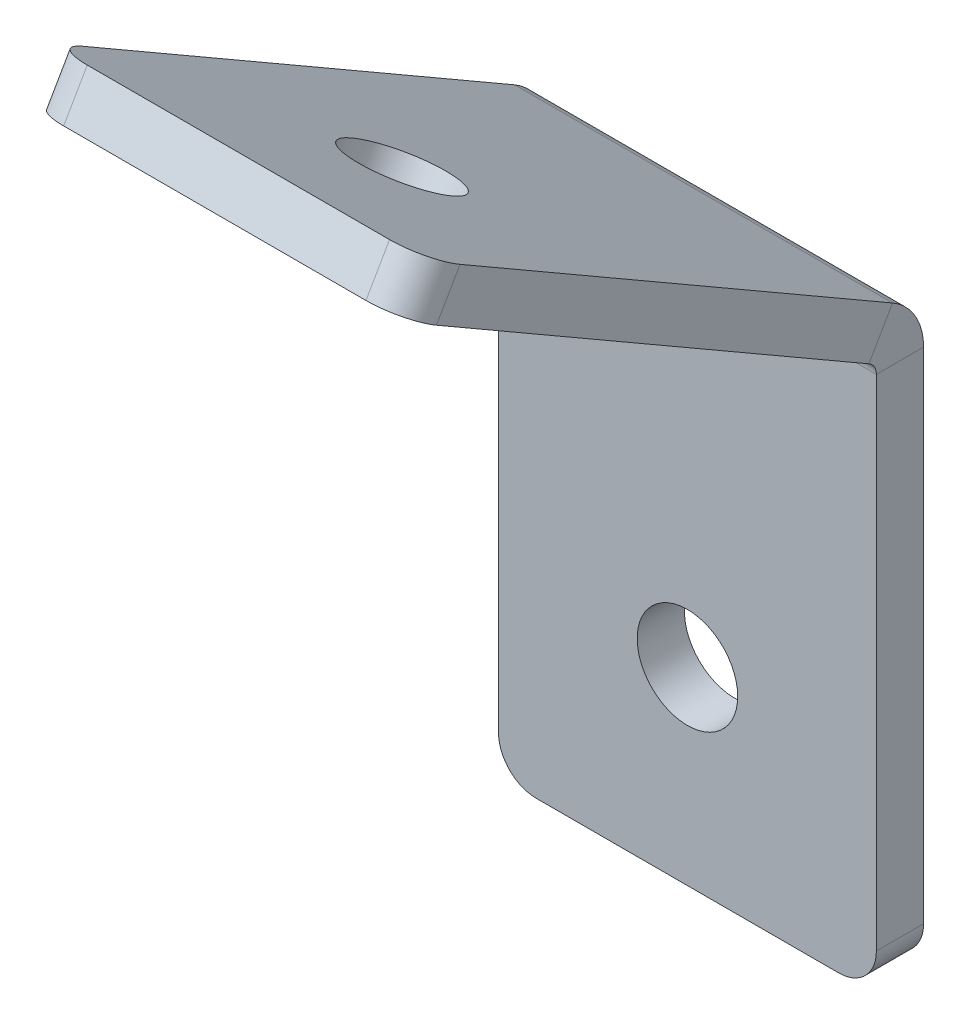
ISO-10303-21;
HEADER;
FILE_DESCRIPTION(('STEP AP214'),'2;1');
FILE_NAME('part.step','',(''),(''),'','','');
FILE_SCHEMA(('AUTOMOTIVE_DESIGN { 1 0 10303 214 1 1 1 1 }'));
ENDSEC;
DATA;
#1=APPLICATION_CONTEXT('core data for automotive mechanical design processes');
#2=APPLICATION_PROTOCOL_DEFINITION('international standard','automotive_design',2000,#1);
#3=PRODUCT_CONTEXT('',#1,'mechanical');
#4=PRODUCT('Part','Part','',(#3));
#5=PRODUCT_RELATED_PRODUCT_CATEGORY('part','',(#4));
#6=PRODUCT_DEFINITION_FORMATION('','',#4);
#7=PRODUCT_DEFINITION_CONTEXT('part definition',#1,'design');
#8=PRODUCT_DEFINITION('design','',#6,#7);
#9=PRODUCT_DEFINITION_SHAPE('','',#8);
#10=(LENGTH_UNIT() NAMED_UNIT(*) SI_UNIT(.MILLI.,.METRE.));
#11=(NAMED_UNIT(*) PLANE_ANGLE_UNIT() SI_UNIT($,.RADIAN.));
#12=(NAMED_UNIT(*) SI_UNIT($,.STERADIAN.) SOLID_ANGLE_UNIT());
#13=UNCERTAINTY_MEASURE_WITH_UNIT(LENGTH_MEASURE(1.E-05),#10,'distance_accuracy_value','');
#14=(GEOMETRIC_REPRESENTATION_CONTEXT(3) GLOBAL_UNCERTAINTY_ASSIGNED_CONTEXT((#13)) GLOBAL_UNIT_ASSIGNED_CONTEXT((#10,
#11,#12)) REPRESENTATION_CONTEXT('',''));
#15=CARTESIAN_POINT('',(0.,0.,0.));
#16=DIRECTION('',(0.,0.,1.));
#17=DIRECTION('',(1.,0.,0.));
#18=AXIS2_PLACEMENT_3D('',#15,#16,#17);
#19=CARTESIAN_POINT('',(-10.16,28.3613076559935,29.5726357634325));
#20=DIRECTION('',(0.,0.86602540378444,-0.499999999999998));
#21=DIRECTION('',(-1.,0.,0.));
#22=AXIS2_PLACEMENT_3D('',#19,#20,#21);
#23=PLANE('',#22);
#24=CARTESIAN_POINT('',(0.,23.2813076559935,20.7738176609826));
#25=DIRECTION('',(0.,-0.86602540378444,0.499999999999998));
#26=DIRECTION('',(1.,0.,0.));
#27=AXIS2_PLACEMENT_3D('',#24,#25,#26);
#28=CIRCLE('',#27,3.3782);
#29=CARTESIAN_POINT('',(3.3782,23.2813076559935,20.7738176609826));
#30=VERTEX_POINT('',#29);
#31=EDGE_CURVE('E221',#30,#30,#28,.T.);
#32=ORIENTED_EDGE('',*,*,#31,.F.);
#33=EDGE_LOOP('',(#32));
#34=FACE_BOUND('',#33,.T.);
#35=DIRECTION('',(0.,-0.499999999999998,-0.86602540378444));
#36=VECTOR('',#35,1.);
#37=CARTESIAN_POINT('',(-12.7,-6.56369234400637,-30.9192386909106));
#38=LINE('',#37,#36);
#39=CARTESIAN_POINT('',(-12.7,28.3613076559935,29.5726357634325));
#40=VERTEX_POINT('',#39);
#41=CARTESIAN_POINT('',(-12.7,11.5762135719239,0.499999999999987));
#42=VERTEX_POINT('',#41);
#43=EDGE_CURVE('E68',#40,#42,#38,.T.);
#44=ORIENTED_EDGE('',*,*,#43,.T.);
#45=DIRECTION('',(1.,0.,0.));
#46=VECTOR('',#45,1.);
#47=CARTESIAN_POINT('',(-10.16,11.5762135719239,0.499999999999983));
#48=LINE('',#47,#46);
#49=CARTESIAN_POINT('',(12.7,11.5762135719239,0.499999999999983));
#50=VERTEX_POINT('',#49);
#51=EDGE_CURVE('E60',#42,#50,#48,.T.);
#52=ORIENTED_EDGE('',*,*,#51,.T.);
#53=DIRECTION('',(0.,0.499999999999998,0.86602540378444));
#54=VECTOR('',#53,1.);
#55=CARTESIAN_POINT('',(12.7,-6.56369234400637,-30.9192386909106));
#56=LINE('',#55,#54);
#57=CARTESIAN_POINT('',(12.7,28.3613076559935,29.5726357634325));
#58=VERTEX_POINT('',#57);
#59=EDGE_CURVE('E76',#50,#58,#56,.T.);
#60=ORIENTED_EDGE('',*,*,#59,.T.);
#61=CARTESIAN_POINT('',(10.16,28.3613076559935,29.5726357634325));
#62=DIRECTION('',(0.,-0.86602540378444,0.499999999999998));
#63=DIRECTION('',(1.,0.,0.));
#64=AXIS2_PLACEMENT_3D('',#61,#62,#63);
#65=CIRCLE('',#64,2.54);
#66=CARTESIAN_POINT('',(10.16,29.6313076559935,31.772340289045));
#67=VERTEX_POINT('',#66);
#68=EDGE_CURVE('E243',#58,#67,#65,.T.);
#69=ORIENTED_EDGE('',*,*,#68,.T.);
#70=DIRECTION('',(-1.,0.,0.));
#71=VECTOR('',#70,1.);
#72=CARTESIAN_POINT('',(-10.16,29.6313076559935,31.772340289045));
#73=LINE('',#72,#71);
#74=CARTESIAN_POINT('',(-10.16,29.6313076559935,31.772340289045));
#75=VERTEX_POINT('',#74);
#76=EDGE_CURVE('E231',#67,#75,#73,.T.);
#77=ORIENTED_EDGE('',*,*,#76,.T.);
#78=CARTESIAN_POINT('',(-10.16,28.3613076559935,29.5726357634325));
#79=DIRECTION('',(0.,-0.86602540378444,0.499999999999998));
#80=DIRECTION('',(-1.,0.,0.));
#81=AXIS2_PLACEMENT_3D('',#78,#79,#80);
#82=CIRCLE('',#81,2.54);
#83=EDGE_CURVE('E220',#75,#40,#82,.T.);
#84=ORIENTED_EDGE('',*,*,#83,.T.);
#85=EDGE_LOOP('',(#44,#52,#60,#69,#77,#84));
#86=FACE_BOUND('',#85,.T.);
#87=ADVANCED_FACE('F50',(#34,#86),#23,.F.);
#88=CARTESIAN_POINT('',(-10.16,31.1109383130091,27.9851357634325));
#89=DIRECTION('',(0.,-0.86602540378444,0.499999999999998));
#90=DIRECTION('',(1.,0.,0.));
#91=AXIS2_PLACEMENT_3D('',#88,#89,#90);
#92=CYLINDRICAL_SURFACE('',#91,2.54);
#93=ORIENTED_EDGE('',*,*,#83,.F.);
#94=DIRECTION('',(0.,-0.86602540378444,0.499999999999998));
#95=VECTOR('',#94,1.);
#96=CARTESIAN_POINT('',(-10.16,32.3809383130091,30.184840289045));
#97=LINE('',#96,#95);
#98=CARTESIAN_POINT('',(-10.16,32.3809383130091,30.184840289045));
#99=VERTEX_POINT('',#98);
#100=EDGE_CURVE('E250',#99,#75,#97,.T.);
#101=ORIENTED_EDGE('',*,*,#100,.F.);
#102=CARTESIAN_POINT('',(-10.16,31.1109383130091,27.9851357634325));
#103=DIRECTION('',(0.,-0.86602540378444,0.499999999999998));
#104=DIRECTION('',(-1.,0.,0.));
#105=AXIS2_PLACEMENT_3D('',#102,#103,#104);
#106=CIRCLE('',#105,2.54);
#107=CARTESIAN_POINT('',(-12.7,31.1109383130091,27.9851357634325));
#108=VERTEX_POINT('',#107);
#109=EDGE_CURVE('E226',#99,#108,#106,.T.);
#110=ORIENTED_EDGE('',*,*,#109,.T.);
#111=DIRECTION('',(0.,-0.86602540378444,0.499999999999998));
#112=VECTOR('',#111,1.);
#113=CARTESIAN_POINT('',(-12.7,31.1109383130091,27.9851357634325));
#114=LINE('',#113,#112);
#115=EDGE_CURVE('E240',#108,#40,#114,.T.);
#116=ORIENTED_EDGE('',*,*,#115,.T.);
#117=EDGE_LOOP('',(#93,#101,#110,#116));
#118=FACE_BOUND('',#117,.T.);
#119=ADVANCED_FACE('F335',(#118),#92,.T.);
#120=CARTESIAN_POINT('',(-10.16,32.3809383130091,30.184840289045));
#121=DIRECTION('',(0.,0.499999999999998,0.86602540378444));
#122=DIRECTION('',(0.,-0.86602540378444,0.499999999999998));
#123=AXIS2_PLACEMENT_3D('',#120,#121,#122);
#124=PLANE('',#123);
#125=ORIENTED_EDGE('',*,*,#76,.F.);
#126=DIRECTION('',(0.,-0.86602540378444,0.499999999999998));
#127=VECTOR('',#126,1.);
#128=CARTESIAN_POINT('',(10.16,32.3809383130091,30.184840289045));
#129=LINE('',#128,#127);
#130=CARTESIAN_POINT('',(10.16,32.3809383130091,30.184840289045));
#131=VERTEX_POINT('',#130);
#132=EDGE_CURVE('E253',#131,#67,#129,.T.);
#133=ORIENTED_EDGE('',*,*,#132,.F.);
#134=DIRECTION('',(-1.,0.,0.));
#135=VECTOR('',#134,1.);
#136=CARTESIAN_POINT('',(-10.16,32.3809383130091,30.184840289045));
#137=LINE('',#136,#135);
#138=EDGE_CURVE('E236',#131,#99,#137,.T.);
#139=ORIENTED_EDGE('',*,*,#138,.T.);
#140=ORIENTED_EDGE('',*,*,#100,.T.);
#141=EDGE_LOOP('',(#125,#133,#139,#140));
#142=FACE_BOUND('',#141,.T.);
#143=ADVANCED_FACE('F332',(#142),#124,.T.);
#144=CARTESIAN_POINT('',(10.16,31.1109383130091,27.9851357634325));
#145=DIRECTION('',(0.,-0.86602540378444,0.499999999999998));
#146=DIRECTION('',(1.,0.,0.));
#147=AXIS2_PLACEMENT_3D('',#144,#145,#146);
#148=CYLINDRICAL_SURFACE('',#147,2.54);
#149=ORIENTED_EDGE('',*,*,#68,.F.);
#150=DIRECTION('',(0.,-0.86602540378444,0.499999999999998));
#151=VECTOR('',#150,1.);
#152=CARTESIAN_POINT('',(12.7,31.1109383130091,27.9851357634325));
#153=LINE('',#152,#151);
#154=CARTESIAN_POINT('',(12.7,31.1109383130091,27.9851357634325));
#155=VERTEX_POINT('',#154);
#156=EDGE_CURVE('E256',#155,#58,#153,.T.);
#157=ORIENTED_EDGE('',*,*,#156,.F.);
#158=CARTESIAN_POINT('',(10.16,31.1109383130091,27.9851357634325));
#159=DIRECTION('',(0.,-0.86602540378444,0.499999999999998));
#160=DIRECTION('',(1.,0.,0.));
#161=AXIS2_PLACEMENT_3D('',#158,#159,#160);
#162=CIRCLE('',#161,2.54);
#163=EDGE_CURVE('E232',#155,#131,#162,.T.);
#164=ORIENTED_EDGE('',*,*,#163,.T.);
#165=ORIENTED_EDGE('',*,*,#132,.T.);
#166=EDGE_LOOP('',(#149,#157,#164,#165));
#167=FACE_BOUND('',#166,.T.);
#168=ADVANCED_FACE('F329',(#167),#148,.T.);
#169=CARTESIAN_POINT('',(12.7,-3.81406168699077,-32.5067386909106));
#170=DIRECTION('',(1.,0.,0.));
#171=DIRECTION('',(0.,0.86602540378444,-0.499999999999998));
#172=AXIS2_PLACEMENT_3D('',#169,#170,#171);
#173=PLANE('',#172);
#174=DIRECTION('',(0.,-0.866025403784443,0.499999999999992));
#175=VECTOR('',#174,1.);
#176=CARTESIAN_POINT('',(12.7,14.3258442289392,-1.08749999999986));
#177=LINE('',#176,#175);
#178=CARTESIAN_POINT('',(12.7,14.3258442289395,-1.08749999999999));
#179=VERTEX_POINT('',#178);
#180=EDGE_CURVE('E263',#179,#50,#177,.T.);
#181=ORIENTED_EDGE('',*,*,#180,.F.);
#182=DIRECTION('',(0.,0.499999999999998,0.86602540378444));
#183=VECTOR('',#182,1.);
#184=CARTESIAN_POINT('',(12.7,-3.81406168699077,-32.5067386909106));
#185=LINE('',#184,#183);
#186=EDGE_CURVE('E54',#179,#155,#185,.T.);
#187=ORIENTED_EDGE('',*,*,#186,.T.);
#188=ORIENTED_EDGE('',*,*,#156,.T.);
#189=ORIENTED_EDGE('',*,*,#59,.F.);
#190=EDGE_LOOP('',(#181,#187,#188,#189));
#191=FACE_BOUND('',#190,.T.);
#192=ADVANCED_FACE('F318',(#191),#173,.T.);
#193=CARTESIAN_POINT('',(-12.7,-3.81406168699077,-32.5067386909106));
#194=DIRECTION('',(-1.,0.,0.));
#195=DIRECTION('',(0.,-0.499999999999998,-0.86602540378444));
#196=AXIS2_PLACEMENT_3D('',#193,#194,#195);
#197=PLANE('',#196);
#198=DIRECTION('',(0.,0.866025403784443,-0.499999999999992));
#199=VECTOR('',#198,1.);
#200=CARTESIAN_POINT('',(-12.7,14.3258442289392,-1.08749999999986));
#201=LINE('',#200,#199);
#202=CARTESIAN_POINT('',(-12.7,14.3258442289395,-1.08749999999999));
#203=VERTEX_POINT('',#202);
#204=EDGE_CURVE('E12',#42,#203,#201,.T.);
#205=ORIENTED_EDGE('',*,*,#204,.F.);
#206=ORIENTED_EDGE('',*,*,#43,.F.);
#207=ORIENTED_EDGE('',*,*,#115,.F.);
#208=DIRECTION('',(0.,-0.499999999999998,-0.86602540378444));
#209=VECTOR('',#208,1.);
#210=CARTESIAN_POINT('',(-12.7,-3.81406168699077,-32.5067386909106));
#211=LINE('',#210,#209);
#212=EDGE_CURVE('E230',#108,#203,#211,.T.);
#213=ORIENTED_EDGE('',*,*,#212,.T.);
#214=EDGE_LOOP('',(#205,#206,#207,#213));
#215=FACE_BOUND('',#214,.T.);
#216=ADVANCED_FACE('F52',(#215),#197,.T.);
#217=CARTESIAN_POINT('',(-10.16,31.1109383130091,27.9851357634325));
#218=DIRECTION('',(0.,0.86602540378444,-0.499999999999998));
#219=DIRECTION('',(-1.,0.,0.));
#220=AXIS2_PLACEMENT_3D('',#217,#218,#219);
#221=PLANE('',#220);
#222=DIRECTION('',(1.,0.,0.));
#223=VECTOR('',#222,1.);
#224=CARTESIAN_POINT('',(-10.16,14.3258442289395,-1.08749999999999));
#225=LINE('',#224,#223);
#226=EDGE_CURVE('E165',#203,#179,#225,.T.);
#227=ORIENTED_EDGE('',*,*,#226,.F.);
#228=ORIENTED_EDGE('',*,*,#212,.F.);
#229=ORIENTED_EDGE('',*,*,#109,.F.);
#230=ORIENTED_EDGE('',*,*,#138,.F.);
#231=ORIENTED_EDGE('',*,*,#163,.F.);
#232=ORIENTED_EDGE('',*,*,#186,.F.);
#233=EDGE_LOOP('',(#227,#228,#229,#230,#231,#232));
#234=FACE_BOUND('',#233,.T.);
#235=CARTESIAN_POINT('',(0.,26.0309383130091,19.1863176609826));
#236=DIRECTION('',(0.,-0.86602540378444,0.499999999999998));
#237=DIRECTION('',(1.,0.,0.));
#238=AXIS2_PLACEMENT_3D('',#235,#236,#237);
#239=CIRCLE('',#238,3.3782);
#240=CARTESIAN_POINT('',(3.3782,26.0309383130091,19.1863176609826));
#241=VERTEX_POINT('',#240);
#242=EDGE_CURVE('E216',#241,#241,#239,.T.);
#243=ORIENTED_EDGE('',*,*,#242,.T.);
#244=EDGE_LOOP('',(#243));
#245=FACE_BOUND('',#244,.T.);
#246=ADVANCED_FACE('F322',(#234,#245),#221,.T.);
#247=CARTESIAN_POINT('',(0.,26.0309383130091,19.1863176609826));
#248=DIRECTION('',(0.,-0.86602540378444,0.499999999999998));
#249=DIRECTION('',(1.,0.,0.));
#250=AXIS2_PLACEMENT_3D('',#247,#248,#249);
#251=CYLINDRICAL_SURFACE('',#250,3.3782);
#252=ORIENTED_EDGE('',*,*,#242,.F.);
#253=EDGE_LOOP('',(#252));
#254=FACE_BOUND('',#253,.T.);
#255=ORIENTED_EDGE('',*,*,#31,.T.);
#256=EDGE_LOOP('',(#255));
#257=FACE_BOUND('',#256,.T.);
#258=ADVANCED_FACE('F348',(#254,#257),#251,.F.);
#259=CARTESIAN_POINT('',(-10.16,-22.86,-3.175));
#260=DIRECTION('',(0.,0.,1.));
#261=DIRECTION('',(1.,0.,0.));
#262=AXIS2_PLACEMENT_3D('',#259,#260,#261);
#263=CYLINDRICAL_SURFACE('',#262,2.54);
#264=CARTESIAN_POINT('',(-10.16,-22.86,0.));
#265=DIRECTION('',(0.,0.,1.));
#266=DIRECTION('',(1.,0.,0.));
#267=AXIS2_PLACEMENT_3D('',#264,#265,#266);
#268=CIRCLE('',#267,2.54);
#269=CARTESIAN_POINT('',(-12.7,-22.86,0.));
#270=VERTEX_POINT('',#269);
#271=CARTESIAN_POINT('',(-10.16,-25.4,0.));
#272=VERTEX_POINT('',#271);
#273=EDGE_CURVE('E293',#270,#272,#268,.T.);
#274=ORIENTED_EDGE('',*,*,#273,.F.);
#275=DIRECTION('',(0.,0.,1.));
#276=VECTOR('',#275,1.);
#277=CARTESIAN_POINT('',(-12.7,-22.86,-3.175));
#278=LINE('',#277,#276);
#279=CARTESIAN_POINT('',(-12.7,-22.86,-3.175));
#280=VERTEX_POINT('',#279);
#281=EDGE_CURVE('E225',#280,#270,#278,.T.);
#282=ORIENTED_EDGE('',*,*,#281,.F.);
#283=CARTESIAN_POINT('',(-10.16,-22.86,-3.175));
#284=DIRECTION('',(0.,0.,1.));
#285=DIRECTION('',(1.,0.,0.));
#286=AXIS2_PLACEMENT_3D('',#283,#284,#285);
#287=CIRCLE('',#286,2.54);
#288=CARTESIAN_POINT('',(-10.16,-25.4,-3.175));
#289=VERTEX_POINT('',#288);
#290=EDGE_CURVE('E210',#280,#289,#287,.T.);
#291=ORIENTED_EDGE('',*,*,#290,.T.);
#292=DIRECTION('',(0.,0.,1.));
#293=VECTOR('',#292,1.);
#294=CARTESIAN_POINT('',(-10.16,-25.4,-3.175));
#295=LINE('',#294,#293);
#296=EDGE_CURVE('E207',#289,#272,#295,.T.);
#297=ORIENTED_EDGE('',*,*,#296,.T.);
#298=EDGE_LOOP('',(#274,#282,#291,#297));
#299=FACE_BOUND('',#298,.T.);
#300=ADVANCED_FACE('F395',(#299),#263,.T.);
#301=CARTESIAN_POINT('',(-10.16,-25.4,-3.175));
#302=DIRECTION('',(0.,-1.,0.));
#303=DIRECTION('',(0.,0.,-1.));
#304=AXIS2_PLACEMENT_3D('',#301,#302,#303);
#305=PLANE('',#304);
#306=DIRECTION('',(1.,0.,0.));
#307=VECTOR('',#306,1.);
#308=CARTESIAN_POINT('',(-10.16,-25.4,0.));
#309=LINE('',#308,#307);
#310=CARTESIAN_POINT('',(10.16,-25.4,0.));
#311=VERTEX_POINT('',#310);
#312=EDGE_CURVE('E289',#272,#311,#309,.T.);
#313=ORIENTED_EDGE('',*,*,#312,.F.);
#314=ORIENTED_EDGE('',*,*,#296,.F.);
#315=DIRECTION('',(1.,0.,0.));
#316=VECTOR('',#315,1.);
#317=CARTESIAN_POINT('',(-10.16,-25.4,-3.175));
#318=LINE('',#317,#316);
#319=CARTESIAN_POINT('',(10.16,-25.4,-3.175));
#320=VERTEX_POINT('',#319);
#321=EDGE_CURVE('E203',#289,#320,#318,.T.);
#322=ORIENTED_EDGE('',*,*,#321,.T.);
#323=DIRECTION('',(0.,0.,1.));
#324=VECTOR('',#323,1.);
#325=CARTESIAN_POINT('',(10.16,-25.4,-3.175));
#326=LINE('',#325,#324);
#327=EDGE_CURVE('E200',#320,#311,#326,.T.);
#328=ORIENTED_EDGE('',*,*,#327,.T.);
#329=EDGE_LOOP('',(#313,#314,#322,#328));
#330=FACE_BOUND('',#329,.T.);
#331=ADVANCED_FACE('F412',(#330),#305,.T.);
#332=CARTESIAN_POINT('',(10.16,-22.86,-3.175));
#333=DIRECTION('',(0.,0.,1.));
#334=DIRECTION('',(1.,0.,0.));
#335=AXIS2_PLACEMENT_3D('',#332,#333,#334);
#336=CYLINDRICAL_SURFACE('',#335,2.54);
#337=CARTESIAN_POINT('',(10.16,-22.86,0.));
#338=DIRECTION('',(0.,0.,1.));
#339=DIRECTION('',(-1.,0.,0.));
#340=AXIS2_PLACEMENT_3D('',#337,#338,#339);
#341=CIRCLE('',#340,2.54);
#342=CARTESIAN_POINT('',(12.7,-22.86,0.));
#343=VERTEX_POINT('',#342);
#344=EDGE_CURVE('E285',#311,#343,#341,.T.);
#345=ORIENTED_EDGE('',*,*,#344,.F.);
#346=ORIENTED_EDGE('',*,*,#327,.F.);
#347=CARTESIAN_POINT('',(10.16,-22.86,-3.175));
#348=DIRECTION('',(0.,0.,1.));
#349=DIRECTION('',(-1.,0.,0.));
#350=AXIS2_PLACEMENT_3D('',#347,#348,#349);
#351=CIRCLE('',#350,2.54);
#352=CARTESIAN_POINT('',(12.7,-22.86,-3.175));
#353=VERTEX_POINT('',#352);
#354=EDGE_CURVE('E197',#320,#353,#351,.T.);
#355=ORIENTED_EDGE('',*,*,#354,.T.);
#356=DIRECTION('',(0.,0.,1.));
#357=VECTOR('',#356,1.);
#358=CARTESIAN_POINT('',(12.7,-22.86,-3.175));
#359=LINE('',#358,#357);
#360=EDGE_CURVE('E183',#353,#343,#359,.T.);
#361=ORIENTED_EDGE('',*,*,#360,.T.);
#362=EDGE_LOOP('',(#345,#346,#355,#361));
#363=FACE_BOUND('',#362,.T.);
#364=ADVANCED_FACE('F421',(#363),#336,.T.);
#365=CARTESIAN_POINT('',(0.,-12.7,-3.175));
#366=DIRECTION('',(0.,0.,1.));
#367=DIRECTION('',(1.,0.,0.));
#368=AXIS2_PLACEMENT_3D('',#365,#366,#367);
#369=CYLINDRICAL_SURFACE('',#368,3.3782);
#370=CARTESIAN_POINT('',(0.,-12.7,-3.175));
#371=DIRECTION('',(0.,0.,1.));
#372=DIRECTION('',(1.,0.,0.));
#373=AXIS2_PLACEMENT_3D('',#370,#371,#372);
#374=CIRCLE('',#373,3.3782);
#375=CARTESIAN_POINT('',(3.3782,-12.7,-3.175));
#376=VERTEX_POINT('',#375);
#377=EDGE_CURVE('E180',#376,#376,#374,.T.);
#378=ORIENTED_EDGE('',*,*,#377,.F.);
#379=EDGE_LOOP('',(#378));
#380=FACE_BOUND('',#379,.T.);
#381=CARTESIAN_POINT('',(0.,-12.7,0.));
#382=DIRECTION('',(0.,0.,1.));
#383=DIRECTION('',(1.,0.,0.));
#384=AXIS2_PLACEMENT_3D('',#381,#382,#383);
#385=CIRCLE('',#384,3.3782);
#386=CARTESIAN_POINT('',(3.3782,-12.7,0.));
#387=VERTEX_POINT('',#386);
#388=EDGE_CURVE('E191',#387,#387,#385,.T.);
#389=ORIENTED_EDGE('',*,*,#388,.T.);
#390=EDGE_LOOP('',(#389));
#391=FACE_BOUND('',#390,.T.);
#392=ADVANCED_FACE('F430',(#380,#391),#369,.F.);
#393=CARTESIAN_POINT('',(-10.16,46.99,-3.175));
#394=DIRECTION('',(0.,0.,-1.));
#395=DIRECTION('',(-1.,0.,0.));
#396=AXIS2_PLACEMENT_3D('',#393,#394,#395);
#397=PLANE('',#396);
#398=ORIENTED_EDGE('',*,*,#377,.T.);
#399=EDGE_LOOP('',(#398));
#400=FACE_BOUND('',#399,.T.);
#401=DIRECTION('',(0.,-1.,0.));
#402=VECTOR('',#401,1.);
#403=CARTESIAN_POINT('',(-12.7,-22.86,-3.175));
#404=LINE('',#403,#402);
#405=CARTESIAN_POINT('',(-12.7,10.7101881681394,-3.175));
#406=VERTEX_POINT('',#405);
#407=EDGE_CURVE('E177',#406,#280,#404,.T.);
#408=ORIENTED_EDGE('',*,*,#407,.F.);
#409=DIRECTION('',(1.,0.,0.));
#410=VECTOR('',#409,1.);
#411=CARTESIAN_POINT('',(-10.16,10.7101881681394,-3.175));
#412=LINE('',#411,#410);
#413=CARTESIAN_POINT('',(12.7,10.7101881681394,-3.175));
#414=VERTEX_POINT('',#413);
#415=EDGE_CURVE('E163',#406,#414,#412,.T.);
#416=ORIENTED_EDGE('',*,*,#415,.T.);
#417=DIRECTION('',(0.,1.,0.));
#418=VECTOR('',#417,1.);
#419=CARTESIAN_POINT('',(12.7,-22.86,-3.175));
#420=LINE('',#419,#418);
#421=EDGE_CURVE('E156',#353,#414,#420,.T.);
#422=ORIENTED_EDGE('',*,*,#421,.F.);
#423=ORIENTED_EDGE('',*,*,#354,.F.);
#424=ORIENTED_EDGE('',*,*,#321,.F.);
#425=ORIENTED_EDGE('',*,*,#290,.F.);
#426=EDGE_LOOP('',(#408,#416,#422,#423,#424,#425));
#427=FACE_BOUND('',#426,.T.);
#428=ADVANCED_FACE('F173',(#400,#427),#397,.T.);
#429=CARTESIAN_POINT('',(12.7,-22.86,-3.175));
#430=DIRECTION('',(1.,0.,0.));
#431=DIRECTION('',(0.,0.,-1.));
#432=AXIS2_PLACEMENT_3D('',#429,#430,#431);
#433=PLANE('',#432);
#434=ORIENTED_EDGE('',*,*,#421,.T.);
#435=DIRECTION('',(0.,0.,1.));
#436=VECTOR('',#435,1.);
#437=CARTESIAN_POINT('',(12.7,10.7101881681394,-3.17499999999977));
#438=LINE('',#437,#436);
#439=CARTESIAN_POINT('',(12.7,10.7101881681394,0.));
#440=VERTEX_POINT('',#439);
#441=EDGE_CURVE('E143',#414,#440,#438,.T.);
#442=ORIENTED_EDGE('',*,*,#441,.T.);
#443=DIRECTION('',(0.,1.,0.));
#444=VECTOR('',#443,1.);
#445=CARTESIAN_POINT('',(12.7,-22.86,0.));
#446=LINE('',#445,#444);
#447=EDGE_CURVE('E281',#343,#440,#446,.T.);
#448=ORIENTED_EDGE('',*,*,#447,.F.);
#449=ORIENTED_EDGE('',*,*,#360,.F.);
#450=EDGE_LOOP('',(#434,#442,#448,#449));
#451=FACE_BOUND('',#450,.T.);
#452=ADVANCED_FACE('F182',(#451),#433,.T.);
#453=CARTESIAN_POINT('',(-10.16,46.99,0.));
#454=DIRECTION('',(0.,0.,-1.));
#455=DIRECTION('',(-1.,0.,0.));
#456=AXIS2_PLACEMENT_3D('',#453,#454,#455);
#457=PLANE('',#456);
#458=DIRECTION('',(1.,0.,0.));
#459=VECTOR('',#458,1.);
#460=CARTESIAN_POINT('',(-10.16,10.7101881681394,0.));
#461=LINE('',#460,#459);
#462=CARTESIAN_POINT('',(-12.7,10.7101881681394,0.));
#463=VERTEX_POINT('',#462);
#464=EDGE_CURVE('E167',#463,#440,#461,.T.);
#465=ORIENTED_EDGE('',*,*,#464,.F.);
#466=DIRECTION('',(0.,-1.,0.));
#467=VECTOR('',#466,1.);
#468=CARTESIAN_POINT('',(-12.7,-22.86,0.));
#469=LINE('',#468,#467);
#470=EDGE_CURVE('E155',#463,#270,#469,.T.);
#471=ORIENTED_EDGE('',*,*,#470,.T.);
#472=ORIENTED_EDGE('',*,*,#273,.T.);
#473=ORIENTED_EDGE('',*,*,#312,.T.);
#474=ORIENTED_EDGE('',*,*,#344,.T.);
#475=ORIENTED_EDGE('',*,*,#447,.T.);
#476=EDGE_LOOP('',(#465,#471,#472,#473,#474,#475));
#477=FACE_BOUND('',#476,.T.);
#478=ORIENTED_EDGE('',*,*,#388,.F.);
#479=EDGE_LOOP('',(#478));
#480=FACE_BOUND('',#479,.T.);
#481=ADVANCED_FACE('F455',(#477,#480),#457,.F.);
#482=CARTESIAN_POINT('',(-12.7,-22.86,-3.175));
#483=DIRECTION('',(-1.,0.,0.));
#484=DIRECTION('',(0.,-1.,0.));
#485=AXIS2_PLACEMENT_3D('',#482,#483,#484);
#486=PLANE('',#485);
#487=ORIENTED_EDGE('',*,*,#470,.F.);
#488=DIRECTION('',(0.,0.,-1.));
#489=VECTOR('',#488,1.);
#490=CARTESIAN_POINT('',(-12.7,10.7101881681394,-3.17499999999977));
#491=LINE('',#490,#489);
#492=EDGE_CURVE('E278',#463,#406,#491,.T.);
#493=ORIENTED_EDGE('',*,*,#492,.T.);
#494=ORIENTED_EDGE('',*,*,#407,.T.);
#495=ORIENTED_EDGE('',*,*,#281,.T.);
#496=EDGE_LOOP('',(#487,#493,#494,#495));
#497=FACE_BOUND('',#496,.T.);
#498=ADVANCED_FACE('F463',(#497),#486,.T.);
#499=CARTESIAN_POINT('',(-12.7,10.7101881681394,1.));
#500=DIRECTION('',(-1.,0.,0.));
#501=DIRECTION('',(0.,0.,1.));
#502=AXIS2_PLACEMENT_3D('',#499,#500,#501);
#503=PLANE('',#502);
#504=ORIENTED_EDGE('',*,*,#492,.F.);
#505=CARTESIAN_POINT('',(-12.7,10.7101881681394,1.));
#506=DIRECTION('',(1.,0.,0.));
#507=DIRECTION('',(0.,1.,0.));
#508=AXIS2_PLACEMENT_3D('',#505,#506,#507);
#509=CIRCLE('',#508,1.);
#510=EDGE_CURVE('E304',#463,#42,#509,.T.);
#511=ORIENTED_EDGE('',*,*,#510,.T.);
#512=ORIENTED_EDGE('',*,*,#204,.T.);
#513=CARTESIAN_POINT('',(-12.7,10.7101881681394,1.));
#514=DIRECTION('',(1.,0.,0.));
#515=DIRECTION('',(0.,0.,1.));
#516=AXIS2_PLACEMENT_3D('',#513,#514,#515);
#517=CIRCLE('',#516,4.175);
#518=EDGE_CURVE('E168',#406,#203,#517,.T.);
#519=ORIENTED_EDGE('',*,*,#518,.F.);
#520=EDGE_LOOP('',(#504,#511,#512,#519));
#521=FACE_BOUND('',#520,.T.);
#522=ADVANCED_FACE('F310',(#521),#503,.T.);
#523=CARTESIAN_POINT('',(12.7,10.7101881681394,1.));
#524=DIRECTION('',(1.,0.,0.));
#525=DIRECTION('',(0.,0.,-1.));
#526=AXIS2_PLACEMENT_3D('',#523,#524,#525);
#527=PLANE('',#526);
#528=CARTESIAN_POINT('',(12.7,10.7101881681394,1.));
#529=DIRECTION('',(1.,0.,0.));
#530=DIRECTION('',(0.,1.,0.));
#531=AXIS2_PLACEMENT_3D('',#528,#529,#530);
#532=CIRCLE('',#531,1.);
#533=EDGE_CURVE('E149',#50,#440,#532,.F.);
#534=ORIENTED_EDGE('',*,*,#533,.T.);
#535=ORIENTED_EDGE('',*,*,#441,.F.);
#536=CARTESIAN_POINT('',(12.7,10.7101881681394,1.));
#537=DIRECTION('',(-1.,0.,0.));
#538=DIRECTION('',(0.,0.,-1.));
#539=AXIS2_PLACEMENT_3D('',#536,#537,#538);
#540=CIRCLE('',#539,4.175);
#541=EDGE_CURVE('E147',#179,#414,#540,.T.);
#542=ORIENTED_EDGE('',*,*,#541,.F.);
#543=ORIENTED_EDGE('',*,*,#180,.T.);
#544=EDGE_LOOP('',(#534,#535,#542,#543));
#545=FACE_BOUND('',#544,.T.);
#546=ADVANCED_FACE('F145',(#545),#527,.T.);
#547=CARTESIAN_POINT('',(-25.7406815255346,10.7101881681394,1.));
#548=DIRECTION('',(1.,0.,0.));
#549=DIRECTION('',(0.,1.,0.));
#550=AXIS2_PLACEMENT_3D('',#547,#548,#549);
#551=CYLINDRICAL_SURFACE('',#550,4.175);
#552=ORIENTED_EDGE('',*,*,#226,.T.);
#553=ORIENTED_EDGE('',*,*,#541,.T.);
#554=ORIENTED_EDGE('',*,*,#415,.F.);
#555=ORIENTED_EDGE('',*,*,#518,.T.);
#556=EDGE_LOOP('',(#552,#553,#554,#555));
#557=FACE_BOUND('',#556,.T.);
#558=ADVANCED_FACE('F161',(#557),#551,.T.);
#559=CARTESIAN_POINT('',(-25.7406815255346,10.7101881681394,1.));
#560=DIRECTION('',(1.,0.,0.));
#561=DIRECTION('',(0.,1.,0.));
#562=AXIS2_PLACEMENT_3D('',#559,#560,#561);
#563=CYLINDRICAL_SURFACE('',#562,1.);
#564=ORIENTED_EDGE('',*,*,#51,.F.);
#565=ORIENTED_EDGE('',*,*,#510,.F.);
#566=ORIENTED_EDGE('',*,*,#464,.T.);
#567=ORIENTED_EDGE('',*,*,#533,.F.);
#568=EDGE_LOOP('',(#564,#565,#566,#567));
#569=FACE_BOUND('',#568,.T.);
#570=ADVANCED_FACE('F316',(#569),#563,.F.);
#571=CLOSED_SHELL('',(#87,#119,#143,#168,#192,#216,#246,#258,#300,#331,#364,#392,#428,#452,#481,
#498,#522,#546,#558,#570));
#572=MANIFOLD_SOLID_BREP('B2',#571);
#573=ADVANCED_BREP_SHAPE_REPRESENTATION('',(#18,#572),#14);
#574=SHAPE_DEFINITION_REPRESENTATION(#9,#573);
ENDSEC;
END-ISO-10303-21;
